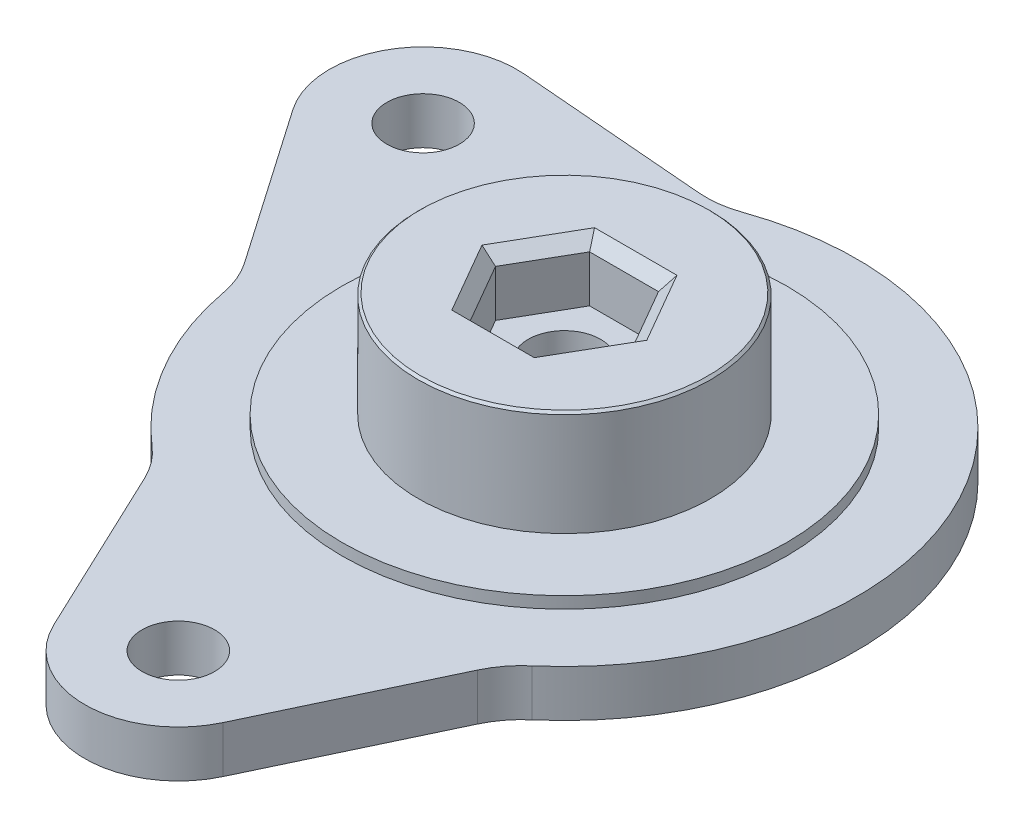
ISO-10303-21;
HEADER;
FILE_DESCRIPTION(('STEP AP214'),'2;1');
FILE_NAME('part.step','',(''),(''),'','','');
FILE_SCHEMA(('AUTOMOTIVE_DESIGN { 1 0 10303 214 1 1 1 1 }'));
ENDSEC;
DATA;
#1=APPLICATION_CONTEXT('core data for automotive mechanical design processes');
#2=APPLICATION_PROTOCOL_DEFINITION('international standard','automotive_design',2000,#1);
#3=PRODUCT_CONTEXT('',#1,'mechanical');
#4=PRODUCT('Part','Part','',(#3));
#5=PRODUCT_RELATED_PRODUCT_CATEGORY('part','',(#4));
#6=PRODUCT_DEFINITION_FORMATION('','',#4);
#7=PRODUCT_DEFINITION_CONTEXT('part definition',#1,'design');
#8=PRODUCT_DEFINITION('design','',#6,#7);
#9=PRODUCT_DEFINITION_SHAPE('','',#8);
#10=(LENGTH_UNIT() NAMED_UNIT(*) SI_UNIT(.MILLI.,.METRE.));
#11=(NAMED_UNIT(*) PLANE_ANGLE_UNIT() SI_UNIT($,.RADIAN.));
#12=(NAMED_UNIT(*) SI_UNIT($,.STERADIAN.) SOLID_ANGLE_UNIT());
#13=UNCERTAINTY_MEASURE_WITH_UNIT(LENGTH_MEASURE(1.E-05),#10,'distance_accuracy_value','');
#14=(GEOMETRIC_REPRESENTATION_CONTEXT(3) GLOBAL_UNCERTAINTY_ASSIGNED_CONTEXT((#13)) GLOBAL_UNIT_ASSIGNED_CONTEXT((#10,
#11,#12)) REPRESENTATION_CONTEXT('',''));
#15=CARTESIAN_POINT('',(0.,0.,0.));
#16=DIRECTION('',(0.,0.,1.));
#17=DIRECTION('',(1.,0.,0.));
#18=AXIS2_PLACEMENT_3D('',#15,#16,#17);
#19=CARTESIAN_POINT('',(0.,0.,0.));
#20=DIRECTION('',(0.,-1.,0.));
#21=DIRECTION('',(0.,0.,-1.));
#22=AXIS2_PLACEMENT_3D('',#19,#20,#21);
#23=CYLINDRICAL_SURFACE('',#22,25.);
#24=CARTESIAN_POINT('',(0.,0.,0.));
#25=DIRECTION('',(0.,-1.,0.));
#26=DIRECTION('',(0.,0.,-1.));
#27=AXIS2_PLACEMENT_3D('',#24,#25,#26);
#28=CIRCLE('',#27,25.);
#29=CARTESIAN_POINT('',(-16.2472606024002,0.,19.0006979586986));
#30=VERTEX_POINT('',#29);
#31=CARTESIAN_POINT('',(-24.5787174230683,0.,4.57019144423525));
#32=VERTEX_POINT('',#31);
#33=EDGE_CURVE('E342',#30,#32,#28,.T.);
#34=ORIENTED_EDGE('',*,*,#33,.F.);
#35=DIRECTION('',(0.,-1.,0.));
#36=VECTOR('',#35,1.);
#37=CARTESIAN_POINT('',(-16.2472606024002,0.,19.0006979586986));
#38=LINE('',#37,#36);
#39=CARTESIAN_POINT('',(-16.2472606024002,4.,19.0006979586986));
#40=VERTEX_POINT('',#39);
#41=EDGE_CURVE('E377',#30,#40,#38,.F.);
#42=ORIENTED_EDGE('',*,*,#41,.T.);
#43=CARTESIAN_POINT('',(0.,4.,0.));
#44=DIRECTION('',(0.,-1.,0.));
#45=DIRECTION('',(0.,0.,-1.));
#46=AXIS2_PLACEMENT_3D('',#43,#44,#45);
#47=CIRCLE('',#46,25.);
#48=CARTESIAN_POINT('',(-24.5787174230683,4.,4.57019144423525));
#49=VERTEX_POINT('',#48);
#50=EDGE_CURVE('E337',#40,#49,#47,.T.);
#51=ORIENTED_EDGE('',*,*,#50,.T.);
#52=DIRECTION('',(0.,-1.,0.));
#53=VECTOR('',#52,1.);
#54=CARTESIAN_POINT('',(-24.5787174230683,0.,4.57019144423525));
#55=LINE('',#54,#53);
#56=EDGE_CURVE('E373',#49,#32,#55,.T.);
#57=ORIENTED_EDGE('',*,*,#56,.T.);
#58=EDGE_LOOP('',(#34,#42,#51,#57));
#59=FACE_BOUND('',#58,.T.);
#60=ADVANCED_FACE('F43',(#59),#23,.T.);
#61=CARTESIAN_POINT('',(-8.33145682066789,0.,-23.570889402934));
#62=VERTEX_POINT('',#61);
#63=CARTESIAN_POINT('',(16.2472606024002,0.,19.0006979586986));
#64=VERTEX_POINT('',#63);
#65=EDGE_CURVE('E341',#62,#64,#28,.T.);
#66=ORIENTED_EDGE('',*,*,#65,.F.);
#67=DIRECTION('',(0.,-1.,0.));
#68=VECTOR('',#67,1.);
#69=CARTESIAN_POINT('',(-8.33145682066789,0.,-23.570889402934));
#70=LINE('',#69,#68);
#71=CARTESIAN_POINT('',(-8.33145682066789,4.,-23.570889402934));
#72=VERTEX_POINT('',#71);
#73=EDGE_CURVE('E363',#62,#72,#70,.F.);
#74=ORIENTED_EDGE('',*,*,#73,.T.);
#75=CARTESIAN_POINT('',(16.2472606024002,4.,19.0006979586986));
#76=VERTEX_POINT('',#75);
#77=EDGE_CURVE('E336',#72,#76,#47,.T.);
#78=ORIENTED_EDGE('',*,*,#77,.T.);
#79=DIRECTION('',(0.,-1.,0.));
#80=VECTOR('',#79,1.);
#81=CARTESIAN_POINT('',(16.2472606024002,0.,19.0006979586986));
#82=LINE('',#81,#80);
#83=EDGE_CURVE('E359',#76,#64,#82,.T.);
#84=ORIENTED_EDGE('',*,*,#83,.T.);
#85=EDGE_LOOP('',(#66,#74,#78,#84));
#86=FACE_BOUND('',#85,.T.);
#87=ADVANCED_FACE('F513',(#86),#23,.T.);
#88=CARTESIAN_POINT('',(0.,0.,0.));
#89=DIRECTION('',(0.,-1.,0.));
#90=DIRECTION('',(0.,0.,-1.));
#91=AXIS2_PLACEMENT_3D('',#88,#89,#90);
#92=PLANE('',#91);
#93=CARTESIAN_POINT('',(0.,0.,0.));
#94=DIRECTION('',(0.,1.,0.));
#95=DIRECTION('',(0.,0.,1.));
#96=AXIS2_PLACEMENT_3D('',#93,#94,#95);
#97=CIRCLE('',#96,3.1);
#98=CARTESIAN_POINT('',(0.,0.,-3.1));
#99=VERTEX_POINT('',#98);
#100=EDGE_CURVE('E271',#99,#99,#97,.T.);
#101=ORIENTED_EDGE('',*,*,#100,.T.);
#102=EDGE_LOOP('',(#101));
#103=FACE_BOUND('',#102,.T.);
#104=DIRECTION('',(-0.427635867687244,0.,-0.903951085328945));
#105=VECTOR('',#104,1.);
#106=CARTESIAN_POINT('',(-19.9881516044401,0.,9.45587730747449));
#107=LINE('',#106,#105);
#108=CARTESIAN_POINT('',(-7.23160868263156,0.,36.421086941498));
#109=VERTEX_POINT('',#108);
#110=CARTESIAN_POINT('',(-14.2147753125368,0.,21.6598343639842));
#111=VERTEX_POINT('',#110);
#112=EDGE_CURVE('E250',#109,#111,#107,.T.);
#113=ORIENTED_EDGE('',*,*,#112,.T.);
#114=CARTESIAN_POINT('',(-21.4463839951683,0.,25.0809213054821));
#115=DIRECTION('',(0.,-1.,0.));
#116=DIRECTION('',(0.,0.,-1.));
#117=AXIS2_PLACEMENT_3D('',#114,#115,#116);
#118=CIRCLE('',#117,8.);
#119=EDGE_CURVE('E395',#111,#30,#118,.F.);
#120=ORIENTED_EDGE('',*,*,#119,.T.);
#121=ORIENTED_EDGE('',*,*,#33,.T.);
#122=CARTESIAN_POINT('',(-32.4439069984501,0.,6.03265270639053));
#123=DIRECTION('',(0.,-1.,0.));
#124=DIRECTION('',(0.,0.,-1.));
#125=AXIS2_PLACEMENT_3D('',#122,#123,#124);
#126=CIRCLE('',#125,8.);
#127=CARTESIAN_POINT('',(-25.8653544572419,0.,1.48043934775248));
#128=VERTEX_POINT('',#127);
#129=EDGE_CURVE('E401',#32,#128,#126,.F.);
#130=ORIENTED_EDGE('',*,*,#129,.T.);
#131=DIRECTION('',(0.569026669829756,0.,0.82231906765103));
#132=VECTOR('',#131,1.);
#133=CARTESIAN_POINT('',(-18.1831057655618,0.,12.5823084104025));
#134=LINE('',#133,#132);
#135=CARTESIAN_POINT('',(-35.1573908660946,0.,-11.9477866413621));
#136=VERTEX_POINT('',#135);
#137=EDGE_CURVE('E211',#136,#128,#134,.T.);
#138=ORIENTED_EDGE('',*,*,#137,.F.);
#139=CARTESIAN_POINT('',(-28.5788383248864,0.,-16.5000000000001));
#140=DIRECTION('',(0.,1.,0.));
#141=DIRECTION('',(-0.866025403784436,0.,-0.500000000000004));
#142=AXIS2_PLACEMENT_3D('',#139,#140,#141);
#143=CIRCLE('',#142,8.);
#144=CARTESIAN_POINT('',(-27.925782183463,0.,-24.4733003001362));
#145=VERTEX_POINT('',#144);
#146=EDGE_CURVE('E192',#145,#136,#143,.T.);
#147=ORIENTED_EDGE('',*,*,#146,.F.);
#148=DIRECTION('',(0.996662537517003,0.,0.0816320176779226));
#149=VECTOR('',#148,1.);
#150=CARTESIAN_POINT('',(1.80504583887842,0.,-22.038185717877));
#151=LINE('',#150,#149);
#152=CARTESIAN_POINT('',(-11.650579144705,0.,-23.1402737117369));
#153=VERTEX_POINT('',#152);
#154=EDGE_CURVE('E209',#145,#153,#151,.T.);
#155=ORIENTED_EDGE('',*,*,#154,.T.);
#156=CARTESIAN_POINT('',(-10.9975230032816,0.,-31.1135740118729));
#157=DIRECTION('',(0.,-1.,0.));
#158=DIRECTION('',(0.,0.,-1.));
#159=AXIS2_PLACEMENT_3D('',#156,#157,#158);
#160=CIRCLE('',#159,8.);
#161=EDGE_CURVE('E383',#153,#62,#160,.F.);
#162=ORIENTED_EDGE('',*,*,#161,.T.);
#163=ORIENTED_EDGE('',*,*,#65,.T.);
#164=CARTESIAN_POINT('',(21.4463839951683,0.,25.0809213054821));
#165=DIRECTION('',(0.,-1.,0.));
#166=DIRECTION('',(0.,0.,-1.));
#167=AXIS2_PLACEMENT_3D('',#164,#165,#166);
#168=CIRCLE('',#167,8.);
#169=CARTESIAN_POINT('',(14.2147753125367,0.,21.6598343639842));
#170=VERTEX_POINT('',#169);
#171=EDGE_CURVE('E389',#64,#170,#168,.F.);
#172=ORIENTED_EDGE('',*,*,#171,.T.);
#173=DIRECTION('',(0.427635867687244,0.,-0.903951085328945));
#174=VECTOR('',#173,1.);
#175=CARTESIAN_POINT('',(19.9881516044401,0.,9.45587730747448));
#176=LINE('',#175,#174);
#177=CARTESIAN_POINT('',(7.23160868263156,0.,36.421086941498));
#178=VERTEX_POINT('',#177);
#179=EDGE_CURVE('E257',#178,#170,#176,.T.);
#180=ORIENTED_EDGE('',*,*,#179,.F.);
#181=CARTESIAN_POINT('',(0.,0.,33.));
#182=DIRECTION('',(0.,1.,0.));
#183=DIRECTION('',(0.,0.,1.));
#184=AXIS2_PLACEMENT_3D('',#181,#182,#183);
#185=CIRCLE('',#184,8.);
#186=EDGE_CURVE('E253',#109,#178,#185,.T.);
#187=ORIENTED_EDGE('',*,*,#186,.F.);
#188=EDGE_LOOP('',(#113,#120,#121,#130,#138,#147,#155,#162,#163,#172,#180,#187));
#189=FACE_BOUND('',#188,.T.);
#190=CARTESIAN_POINT('',(0.,0.,33.));
#191=DIRECTION('',(0.,1.,0.));
#192=DIRECTION('',(0.,0.,1.));
#193=AXIS2_PLACEMENT_3D('',#190,#191,#192);
#194=CIRCLE('',#193,3.1);
#195=CARTESIAN_POINT('',(0.,0.,36.1));
#196=VERTEX_POINT('',#195);
#197=EDGE_CURVE('E261',#196,#196,#194,.T.);
#198=ORIENTED_EDGE('',*,*,#197,.T.);
#199=EDGE_LOOP('',(#198));
#200=FACE_BOUND('',#199,.T.);
#201=CARTESIAN_POINT('',(-28.5788383248864,0.,-16.5000000000001));
#202=DIRECTION('',(0.,1.,0.));
#203=DIRECTION('',(-0.866025403784436,0.,-0.500000000000004));
#204=AXIS2_PLACEMENT_3D('',#201,#202,#203);
#205=CIRCLE('',#204,3.1);
#206=CARTESIAN_POINT('',(-31.2635170766182,0.,-18.0500000000001));
#207=VERTEX_POINT('',#206);
#208=EDGE_CURVE('E227',#207,#207,#205,.T.);
#209=ORIENTED_EDGE('',*,*,#208,.T.);
#210=EDGE_LOOP('',(#209));
#211=FACE_BOUND('',#210,.T.);
#212=ADVANCED_FACE('F207',(#103,#189,#200,#211),#92,.T.);
#213=CARTESIAN_POINT('',(25.,4.,0.));
#214=DIRECTION('',(0.,1.,0.));
#215=DIRECTION('',(0.,0.,1.));
#216=AXIS2_PLACEMENT_3D('',#213,#214,#215);
#217=PLANE('',#216);
#218=CARTESIAN_POINT('',(0.,4.,0.));
#219=DIRECTION('',(0.,-1.,0.));
#220=DIRECTION('',(0.,0.,-1.));
#221=AXIS2_PLACEMENT_3D('',#218,#219,#220);
#222=CIRCLE('',#221,19.);
#223=CARTESIAN_POINT('',(0.,4.,-19.));
#224=VERTEX_POINT('',#223);
#225=EDGE_CURVE('E332',#224,#224,#222,.T.);
#226=ORIENTED_EDGE('',*,*,#225,.T.);
#227=EDGE_LOOP('',(#226));
#228=FACE_BOUND('',#227,.T.);
#229=ORIENTED_EDGE('',*,*,#50,.F.);
#230=CARTESIAN_POINT('',(-21.4463839951683,4.,25.0809213054821));
#231=DIRECTION('',(0.,1.,0.));
#232=DIRECTION('',(0.,0.,1.));
#233=AXIS2_PLACEMENT_3D('',#230,#231,#232);
#234=CIRCLE('',#233,8.);
#235=CARTESIAN_POINT('',(-14.2147753125368,4.,21.6598343639842));
#236=VERTEX_POINT('',#235);
#237=EDGE_CURVE('E398',#40,#236,#234,.F.);
#238=ORIENTED_EDGE('',*,*,#237,.T.);
#239=DIRECTION('',(-0.427635867687244,0.,-0.903951085328945));
#240=VECTOR('',#239,1.);
#241=CARTESIAN_POINT('',(-19.9881516044401,4.,9.45587730747449));
#242=LINE('',#241,#240);
#243=CARTESIAN_POINT('',(-7.23160868263156,4.,36.421086941498));
#244=VERTEX_POINT('',#243);
#245=EDGE_CURVE('E246',#244,#236,#242,.T.);
#246=ORIENTED_EDGE('',*,*,#245,.F.);
#247=CARTESIAN_POINT('',(0.,4.,33.));
#248=DIRECTION('',(0.,1.,0.));
#249=DIRECTION('',(0.,0.,1.));
#250=AXIS2_PLACEMENT_3D('',#247,#248,#249);
#251=CIRCLE('',#250,8.);
#252=CARTESIAN_POINT('',(7.23160868263156,4.,36.421086941498));
#253=VERTEX_POINT('',#252);
#254=EDGE_CURVE('E242',#244,#253,#251,.T.);
#255=ORIENTED_EDGE('',*,*,#254,.T.);
#256=DIRECTION('',(0.427635867687244,0.,-0.903951085328945));
#257=VECTOR('',#256,1.);
#258=CARTESIAN_POINT('',(19.9881516044401,4.,9.45587730747448));
#259=LINE('',#258,#257);
#260=CARTESIAN_POINT('',(14.2147753125367,4.,21.6598343639842));
#261=VERTEX_POINT('',#260);
#262=EDGE_CURVE('E238',#253,#261,#259,.T.);
#263=ORIENTED_EDGE('',*,*,#262,.T.);
#264=CARTESIAN_POINT('',(21.4463839951683,4.,25.0809213054821));
#265=DIRECTION('',(0.,1.,0.));
#266=DIRECTION('',(0.,0.,1.));
#267=AXIS2_PLACEMENT_3D('',#264,#265,#266);
#268=CIRCLE('',#267,8.);
#269=EDGE_CURVE('E392',#261,#76,#268,.F.);
#270=ORIENTED_EDGE('',*,*,#269,.T.);
#271=ORIENTED_EDGE('',*,*,#77,.F.);
#272=CARTESIAN_POINT('',(-10.9975230032816,4.,-31.1135740118729));
#273=DIRECTION('',(0.,1.,0.));
#274=DIRECTION('',(0.,0.,1.));
#275=AXIS2_PLACEMENT_3D('',#272,#273,#274);
#276=CIRCLE('',#275,8.);
#277=CARTESIAN_POINT('',(-11.650579144705,4.,-23.1402737117369));
#278=VERTEX_POINT('',#277);
#279=EDGE_CURVE('E386',#72,#278,#276,.F.);
#280=ORIENTED_EDGE('',*,*,#279,.T.);
#281=DIRECTION('',(0.996662537517003,0.,0.0816320176779225));
#282=VECTOR('',#281,1.);
#283=CARTESIAN_POINT('',(1.80504583887842,4.,-22.038185717877));
#284=LINE('',#283,#282);
#285=CARTESIAN_POINT('',(-27.925782183463,4.,-24.4733003001362));
#286=VERTEX_POINT('',#285);
#287=EDGE_CURVE('E219',#286,#278,#284,.T.);
#288=ORIENTED_EDGE('',*,*,#287,.F.);
#289=CARTESIAN_POINT('',(-28.5788383248864,4.,-16.5000000000001));
#290=DIRECTION('',(0.,1.,0.));
#291=DIRECTION('',(0.,0.,1.));
#292=AXIS2_PLACEMENT_3D('',#289,#290,#291);
#293=CIRCLE('',#292,8.);
#294=CARTESIAN_POINT('',(-35.1573908660946,4.,-11.9477866413621));
#295=VERTEX_POINT('',#294);
#296=EDGE_CURVE('E195',#286,#295,#293,.T.);
#297=ORIENTED_EDGE('',*,*,#296,.T.);
#298=DIRECTION('',(0.569026669829755,0.,0.82231906765103));
#299=VECTOR('',#298,1.);
#300=CARTESIAN_POINT('',(-18.1831057655618,4.,12.5823084104025));
#301=LINE('',#300,#299);
#302=CARTESIAN_POINT('',(-25.8653544572419,4.,1.48043934775249));
#303=VERTEX_POINT('',#302);
#304=EDGE_CURVE('E237',#295,#303,#301,.T.);
#305=ORIENTED_EDGE('',*,*,#304,.T.);
#306=CARTESIAN_POINT('',(-32.4439069984501,4.,6.03265270639053));
#307=DIRECTION('',(0.,1.,0.));
#308=DIRECTION('',(0.,0.,1.));
#309=AXIS2_PLACEMENT_3D('',#306,#307,#308);
#310=CIRCLE('',#309,8.);
#311=EDGE_CURVE('E404',#303,#49,#310,.F.);
#312=ORIENTED_EDGE('',*,*,#311,.T.);
#313=EDGE_LOOP('',(#229,#238,#246,#255,#263,#270,#271,#280,#288,#297,#305,#312));
#314=FACE_BOUND('',#313,.T.);
#315=CARTESIAN_POINT('',(0.,4.,33.));
#316=DIRECTION('',(0.,1.,0.));
#317=DIRECTION('',(0.,0.,1.));
#318=AXIS2_PLACEMENT_3D('',#315,#316,#317);
#319=CIRCLE('',#318,3.1);
#320=CARTESIAN_POINT('',(0.,4.,36.1));
#321=VERTEX_POINT('',#320);
#322=EDGE_CURVE('E201',#321,#321,#319,.T.);
#323=ORIENTED_EDGE('',*,*,#322,.F.);
#324=EDGE_LOOP('',(#323));
#325=FACE_BOUND('',#324,.T.);
#326=CARTESIAN_POINT('',(-28.5788383248864,4.,-16.5000000000001));
#327=DIRECTION('',(0.,1.,0.));
#328=DIRECTION('',(0.,0.,1.));
#329=AXIS2_PLACEMENT_3D('',#326,#327,#328);
#330=CIRCLE('',#329,3.1);
#331=CARTESIAN_POINT('',(-28.5788383248864,4.,-13.4000000000001));
#332=VERTEX_POINT('',#331);
#333=EDGE_CURVE('E233',#332,#332,#330,.T.);
#334=ORIENTED_EDGE('',*,*,#333,.F.);
#335=EDGE_LOOP('',(#334));
#336=FACE_BOUND('',#335,.T.);
#337=ADVANCED_FACE('F523',(#228,#314,#325,#336),#217,.T.);
#338=CARTESIAN_POINT('',(0.,0.,0.));
#339=DIRECTION('',(0.,-1.,0.));
#340=DIRECTION('',(0.,0.,-1.));
#341=AXIS2_PLACEMENT_3D('',#338,#339,#340);
#342=CYLINDRICAL_SURFACE('',#341,19.);
#343=CARTESIAN_POINT('',(0.,5.,0.));
#344=DIRECTION('',(0.,-1.,0.));
#345=DIRECTION('',(0.,0.,-1.));
#346=AXIS2_PLACEMENT_3D('',#343,#344,#345);
#347=CIRCLE('',#346,19.);
#348=CARTESIAN_POINT('',(0.,5.,-19.));
#349=VERTEX_POINT('',#348);
#350=EDGE_CURVE('E328',#349,#349,#347,.T.);
#351=ORIENTED_EDGE('',*,*,#350,.T.);
#352=EDGE_LOOP('',(#351));
#353=FACE_BOUND('',#352,.T.);
#354=ORIENTED_EDGE('',*,*,#225,.F.);
#355=EDGE_LOOP('',(#354));
#356=FACE_BOUND('',#355,.T.);
#357=ADVANCED_FACE('F631',(#353,#356),#342,.T.);
#358=CARTESIAN_POINT('',(19.,5.,0.));
#359=DIRECTION('',(0.,1.,0.));
#360=DIRECTION('',(0.,0.,1.));
#361=AXIS2_PLACEMENT_3D('',#358,#359,#360);
#362=PLANE('',#361);
#363=CARTESIAN_POINT('',(0.,5.,0.));
#364=DIRECTION('',(0.,-1.,0.));
#365=DIRECTION('',(0.,0.,-1.));
#366=AXIS2_PLACEMENT_3D('',#363,#364,#365);
#367=CIRCLE('',#366,12.5);
#368=CARTESIAN_POINT('',(0.,5.,-12.5));
#369=VERTEX_POINT('',#368);
#370=EDGE_CURVE('E308',#369,#369,#367,.T.);
#371=ORIENTED_EDGE('',*,*,#370,.T.);
#372=EDGE_LOOP('',(#371));
#373=FACE_BOUND('',#372,.T.);
#374=ORIENTED_EDGE('',*,*,#350,.F.);
#375=EDGE_LOOP('',(#374));
#376=FACE_BOUND('',#375,.T.);
#377=ADVANCED_FACE('F628',(#373,#376),#362,.T.);
#378=CARTESIAN_POINT('',(0.,0.,0.));
#379=DIRECTION('',(0.,-1.,0.));
#380=DIRECTION('',(0.,0.,-1.));
#381=AXIS2_PLACEMENT_3D('',#378,#379,#380);
#382=CYLINDRICAL_SURFACE('',#381,12.5);
#383=CARTESIAN_POINT('',(0.,13.8,0.));
#384=DIRECTION('',(0.,1.,0.));
#385=DIRECTION('',(0.,0.,1.));
#386=AXIS2_PLACEMENT_3D('',#383,#384,#385);
#387=CIRCLE('',#386,12.5);
#388=CARTESIAN_POINT('',(0.,13.8,12.5));
#389=VERTEX_POINT('',#388);
#390=EDGE_CURVE('E346',#389,#389,#387,.F.);
#391=ORIENTED_EDGE('',*,*,#390,.T.);
#392=EDGE_LOOP('',(#391));
#393=FACE_BOUND('',#392,.T.);
#394=ORIENTED_EDGE('',*,*,#370,.F.);
#395=EDGE_LOOP('',(#394));
#396=FACE_BOUND('',#395,.T.);
#397=ADVANCED_FACE('F625',(#393,#396),#382,.T.);
#398=CARTESIAN_POINT('',(12.5,14.,0.));
#399=DIRECTION('',(0.,1.,0.));
#400=DIRECTION('',(0.,0.,1.));
#401=AXIS2_PLACEMENT_3D('',#398,#399,#400);
#402=PLANE('',#401);
#403=DIRECTION('',(-1.,0.,0.));
#404=VECTOR('',#403,1.);
#405=CARTESIAN_POINT('',(-2.94448637286709,14.,6.1));
#406=LINE('',#405,#404);
#407=CARTESIAN_POINT('',(3.52183664205672,14.,6.1));
#408=VERTEX_POINT('',#407);
#409=CARTESIAN_POINT('',(-3.52183664205672,14.,6.1));
#410=VERTEX_POINT('',#409);
#411=EDGE_CURVE('E423',#408,#410,#406,.T.);
#412=ORIENTED_EDGE('',*,*,#411,.T.);
#413=DIRECTION('',(-0.5,0.,-0.866025403784439));
#414=VECTOR('',#413,1.);
#415=CARTESIAN_POINT('',(-6.75499814951862,14.,0.500000000000001));
#416=LINE('',#415,#414);
#417=CARTESIAN_POINT('',(-7.04367328411343,14.,0.));
#418=VERTEX_POINT('',#417);
#419=EDGE_CURVE('E426',#410,#418,#416,.T.);
#420=ORIENTED_EDGE('',*,*,#419,.T.);
#421=DIRECTION('',(0.5,0.,-0.866025403784439));
#422=VECTOR('',#421,1.);
#423=CARTESIAN_POINT('',(-3.81051177665153,14.,-5.6));
#424=LINE('',#423,#422);
#425=CARTESIAN_POINT('',(-3.52183664205672,14.,-6.1));
#426=VERTEX_POINT('',#425);
#427=EDGE_CURVE('E414',#418,#426,#424,.T.);
#428=ORIENTED_EDGE('',*,*,#427,.T.);
#429=DIRECTION('',(1.,0.,0.));
#430=VECTOR('',#429,1.);
#431=CARTESIAN_POINT('',(2.94448637286709,14.,-6.1));
#432=LINE('',#431,#430);
#433=CARTESIAN_POINT('',(3.52183664205672,14.,-6.1));
#434=VERTEX_POINT('',#433);
#435=EDGE_CURVE('E411',#426,#434,#432,.T.);
#436=ORIENTED_EDGE('',*,*,#435,.T.);
#437=DIRECTION('',(0.5,0.,0.866025403784439));
#438=VECTOR('',#437,1.);
#439=CARTESIAN_POINT('',(6.75499814951862,14.,-0.500000000000002));
#440=LINE('',#439,#438);
#441=CARTESIAN_POINT('',(7.04367328411343,14.,0.));
#442=VERTEX_POINT('',#441);
#443=EDGE_CURVE('E417',#434,#442,#440,.T.);
#444=ORIENTED_EDGE('',*,*,#443,.T.);
#445=DIRECTION('',(-0.5,0.,0.866025403784439));
#446=VECTOR('',#445,1.);
#447=CARTESIAN_POINT('',(3.81051177665153,14.,5.6));
#448=LINE('',#447,#446);
#449=EDGE_CURVE('E420',#442,#408,#448,.T.);
#450=ORIENTED_EDGE('',*,*,#449,.T.);
#451=EDGE_LOOP('',(#412,#420,#428,#436,#444,#450));
#452=FACE_BOUND('',#451,.T.);
#453=CARTESIAN_POINT('',(0.,14.,0.));
#454=DIRECTION('',(0.,1.,0.));
#455=DIRECTION('',(0.,0.,1.));
#456=AXIS2_PLACEMENT_3D('',#453,#454,#455);
#457=CIRCLE('',#456,12.3);
#458=CARTESIAN_POINT('',(0.,14.,12.3));
#459=VERTEX_POINT('',#458);
#460=EDGE_CURVE('E353',#459,#459,#457,.T.);
#461=ORIENTED_EDGE('',*,*,#460,.T.);
#462=EDGE_LOOP('',(#461));
#463=FACE_BOUND('',#462,.T.);
#464=ADVANCED_FACE('F470',(#452,#463),#402,.T.);
#465=CARTESIAN_POINT('',(2.94448637286709,9.,5.1));
#466=DIRECTION('',(0.866025403784439,0.,0.5));
#467=DIRECTION('',(0.5,0.,-0.866025403784439));
#468=AXIS2_PLACEMENT_3D('',#465,#466,#467);
#469=PLANE('',#468);
#470=DIRECTION('',(0.,1.,0.));
#471=VECTOR('',#470,1.);
#472=CARTESIAN_POINT('',(2.94448637286709,9.,5.1));
#473=LINE('',#472,#471);
#474=CARTESIAN_POINT('',(2.94448637286709,9.,5.1));
#475=VERTEX_POINT('',#474);
#476=CARTESIAN_POINT('',(2.94448637286709,13.,5.1));
#477=VERTEX_POINT('',#476);
#478=EDGE_CURVE('E304',#475,#477,#473,.T.);
#479=ORIENTED_EDGE('',*,*,#478,.T.);
#480=DIRECTION('',(0.5,0.,-0.866025403784439));
#481=VECTOR('',#480,1.);
#482=CARTESIAN_POINT('',(5.88897274573418,13.,0.));
#483=LINE('',#482,#481);
#484=CARTESIAN_POINT('',(5.88897274573418,13.,0.));
#485=VERTEX_POINT('',#484);
#486=EDGE_CURVE('E433',#477,#485,#483,.T.);
#487=ORIENTED_EDGE('',*,*,#486,.T.);
#488=DIRECTION('',(0.,1.,0.));
#489=VECTOR('',#488,1.);
#490=CARTESIAN_POINT('',(5.88897274573418,9.,0.));
#491=LINE('',#490,#489);
#492=CARTESIAN_POINT('',(5.88897274573418,9.,0.));
#493=VERTEX_POINT('',#492);
#494=EDGE_CURVE('E303',#493,#485,#491,.T.);
#495=ORIENTED_EDGE('',*,*,#494,.F.);
#496=DIRECTION('',(0.5,0.,-0.866025403784439));
#497=VECTOR('',#496,1.);
#498=CARTESIAN_POINT('',(2.94448637286709,9.,5.1));
#499=LINE('',#498,#497);
#500=EDGE_CURVE('E279',#475,#493,#499,.T.);
#501=ORIENTED_EDGE('',*,*,#500,.F.);
#502=EDGE_LOOP('',(#479,#487,#495,#501));
#503=FACE_BOUND('',#502,.T.);
#504=ADVANCED_FACE('F495',(#503),#469,.F.);
#505=CARTESIAN_POINT('',(-2.94448637286709,9.,5.1));
#506=DIRECTION('',(0.,0.,1.));
#507=DIRECTION('',(1.,0.,0.));
#508=AXIS2_PLACEMENT_3D('',#505,#506,#507);
#509=PLANE('',#508);
#510=DIRECTION('',(0.,1.,0.));
#511=VECTOR('',#510,1.);
#512=CARTESIAN_POINT('',(-2.94448637286709,9.,5.1));
#513=LINE('',#512,#511);
#514=CARTESIAN_POINT('',(-2.94448637286709,9.,5.1));
#515=VERTEX_POINT('',#514);
#516=CARTESIAN_POINT('',(-2.94448637286709,13.,5.1));
#517=VERTEX_POINT('',#516);
#518=EDGE_CURVE('E309',#515,#517,#513,.T.);
#519=ORIENTED_EDGE('',*,*,#518,.T.);
#520=DIRECTION('',(1.,0.,0.));
#521=VECTOR('',#520,1.);
#522=CARTESIAN_POINT('',(2.94448637286709,13.,5.1));
#523=LINE('',#522,#521);
#524=EDGE_CURVE('E430',#517,#477,#523,.T.);
#525=ORIENTED_EDGE('',*,*,#524,.T.);
#526=ORIENTED_EDGE('',*,*,#478,.F.);
#527=DIRECTION('',(1.,0.,0.));
#528=VECTOR('',#527,1.);
#529=CARTESIAN_POINT('',(-2.94448637286709,9.,5.1));
#530=LINE('',#529,#528);
#531=EDGE_CURVE('E299',#515,#475,#530,.T.);
#532=ORIENTED_EDGE('',*,*,#531,.F.);
#533=EDGE_LOOP('',(#519,#525,#526,#532));
#534=FACE_BOUND('',#533,.T.);
#535=ADVANCED_FACE('F609',(#534),#509,.F.);
#536=CARTESIAN_POINT('',(-5.88897274573418,9.,0.));
#537=DIRECTION('',(-0.866025403784439,0.,0.5));
#538=DIRECTION('',(0.5,0.,0.866025403784439));
#539=AXIS2_PLACEMENT_3D('',#536,#537,#538);
#540=PLANE('',#539);
#541=DIRECTION('',(0.,1.,0.));
#542=VECTOR('',#541,1.);
#543=CARTESIAN_POINT('',(-5.88897274573418,9.,0.));
#544=LINE('',#543,#542);
#545=CARTESIAN_POINT('',(-5.88897274573418,9.,0.));
#546=VERTEX_POINT('',#545);
#547=CARTESIAN_POINT('',(-5.88897274573418,13.,0.));
#548=VERTEX_POINT('',#547);
#549=EDGE_CURVE('E313',#546,#548,#544,.T.);
#550=ORIENTED_EDGE('',*,*,#549,.T.);
#551=DIRECTION('',(0.5,0.,0.866025403784439));
#552=VECTOR('',#551,1.);
#553=CARTESIAN_POINT('',(-2.94448637286709,13.,5.1));
#554=LINE('',#553,#552);
#555=EDGE_CURVE('E407',#548,#517,#554,.T.);
#556=ORIENTED_EDGE('',*,*,#555,.T.);
#557=ORIENTED_EDGE('',*,*,#518,.F.);
#558=DIRECTION('',(0.5,0.,0.866025403784438));
#559=VECTOR('',#558,1.);
#560=CARTESIAN_POINT('',(-5.88897274573418,9.,0.));
#561=LINE('',#560,#559);
#562=EDGE_CURVE('E295',#546,#515,#561,.T.);
#563=ORIENTED_EDGE('',*,*,#562,.F.);
#564=EDGE_LOOP('',(#550,#556,#557,#563));
#565=FACE_BOUND('',#564,.T.);
#566=ADVANCED_FACE('F485',(#565),#540,.F.);
#567=CARTESIAN_POINT('',(-2.94448637286709,9.,-5.1));
#568=DIRECTION('',(-0.866025403784439,0.,-0.5));
#569=DIRECTION('',(-0.5,0.,0.866025403784439));
#570=AXIS2_PLACEMENT_3D('',#567,#568,#569);
#571=PLANE('',#570);
#572=DIRECTION('',(0.,1.,0.));
#573=VECTOR('',#572,1.);
#574=CARTESIAN_POINT('',(-2.94448637286709,9.,-5.1));
#575=LINE('',#574,#573);
#576=CARTESIAN_POINT('',(-2.94448637286709,9.,-5.1));
#577=VERTEX_POINT('',#576);
#578=CARTESIAN_POINT('',(-2.94448637286709,13.,-5.1));
#579=VERTEX_POINT('',#578);
#580=EDGE_CURVE('E317',#577,#579,#575,.T.);
#581=ORIENTED_EDGE('',*,*,#580,.T.);
#582=DIRECTION('',(-0.5,0.,0.866025403784439));
#583=VECTOR('',#582,1.);
#584=CARTESIAN_POINT('',(-5.88897274573418,13.,0.));
#585=LINE('',#584,#583);
#586=EDGE_CURVE('E54',#579,#548,#585,.T.);
#587=ORIENTED_EDGE('',*,*,#586,.T.);
#588=ORIENTED_EDGE('',*,*,#549,.F.);
#589=DIRECTION('',(-0.5,0.,0.866025403784439));
#590=VECTOR('',#589,1.);
#591=CARTESIAN_POINT('',(-2.94448637286709,9.,-5.1));
#592=LINE('',#591,#590);
#593=EDGE_CURVE('E291',#577,#546,#592,.T.);
#594=ORIENTED_EDGE('',*,*,#593,.F.);
#595=EDGE_LOOP('',(#581,#587,#588,#594));
#596=FACE_BOUND('',#595,.T.);
#597=ADVANCED_FACE('F481',(#596),#571,.F.);
#598=CARTESIAN_POINT('',(2.94448637286709,9.,-5.1));
#599=DIRECTION('',(0.,0.,-1.));
#600=DIRECTION('',(-1.,0.,0.));
#601=AXIS2_PLACEMENT_3D('',#598,#599,#600);
#602=PLANE('',#601);
#603=DIRECTION('',(0.,1.,0.));
#604=VECTOR('',#603,1.);
#605=CARTESIAN_POINT('',(2.94448637286709,9.,-5.1));
#606=LINE('',#605,#604);
#607=CARTESIAN_POINT('',(2.94448637286709,9.,-5.1));
#608=VERTEX_POINT('',#607);
#609=CARTESIAN_POINT('',(2.94448637286709,13.,-5.1));
#610=VERTEX_POINT('',#609);
#611=EDGE_CURVE('E320',#608,#610,#606,.T.);
#612=ORIENTED_EDGE('',*,*,#611,.T.);
#613=DIRECTION('',(-1.,0.,0.));
#614=VECTOR('',#613,1.);
#615=CARTESIAN_POINT('',(-2.94448637286709,13.,-5.1));
#616=LINE('',#615,#614);
#617=EDGE_CURVE('E11',#610,#579,#616,.T.);
#618=ORIENTED_EDGE('',*,*,#617,.T.);
#619=ORIENTED_EDGE('',*,*,#580,.F.);
#620=DIRECTION('',(-1.,0.,0.));
#621=VECTOR('',#620,1.);
#622=CARTESIAN_POINT('',(2.94448637286709,9.,-5.1));
#623=LINE('',#622,#621);
#624=EDGE_CURVE('E287',#608,#577,#623,.T.);
#625=ORIENTED_EDGE('',*,*,#624,.F.);
#626=EDGE_LOOP('',(#612,#618,#619,#625));
#627=FACE_BOUND('',#626,.T.);
#628=ADVANCED_FACE('F491',(#627),#602,.F.);
#629=CARTESIAN_POINT('',(5.88897274573418,9.,0.));
#630=DIRECTION('',(0.866025403784439,0.,-0.5));
#631=DIRECTION('',(-0.5,0.,-0.866025403784439));
#632=AXIS2_PLACEMENT_3D('',#629,#630,#631);
#633=PLANE('',#632);
#634=ORIENTED_EDGE('',*,*,#494,.T.);
#635=DIRECTION('',(-0.5,0.,-0.866025403784439));
#636=VECTOR('',#635,1.);
#637=CARTESIAN_POINT('',(2.94448637286709,13.,-5.1));
#638=LINE('',#637,#636);
#639=EDGE_CURVE('E68',#485,#610,#638,.T.);
#640=ORIENTED_EDGE('',*,*,#639,.T.);
#641=ORIENTED_EDGE('',*,*,#611,.F.);
#642=DIRECTION('',(-0.5,0.,-0.866025403784438));
#643=VECTOR('',#642,1.);
#644=CARTESIAN_POINT('',(5.88897274573418,9.,0.));
#645=LINE('',#644,#643);
#646=EDGE_CURVE('E283',#493,#608,#645,.T.);
#647=ORIENTED_EDGE('',*,*,#646,.F.);
#648=EDGE_LOOP('',(#634,#640,#641,#647));
#649=FACE_BOUND('',#648,.T.);
#650=ADVANCED_FACE('F492',(#649),#633,.F.);
#651=CARTESIAN_POINT('',(0.,9.,0.));
#652=DIRECTION('',(0.,1.,0.));
#653=DIRECTION('',(0.,0.,1.));
#654=AXIS2_PLACEMENT_3D('',#651,#652,#653);
#655=PLANE('',#654);
#656=CARTESIAN_POINT('',(0.,9.,0.));
#657=DIRECTION('',(0.,1.,0.));
#658=DIRECTION('',(0.,0.,1.));
#659=AXIS2_PLACEMENT_3D('',#656,#657,#658);
#660=CIRCLE('',#659,3.1);
#661=CARTESIAN_POINT('',(0.,9.,-3.1));
#662=VERTEX_POINT('',#661);
#663=EDGE_CURVE('E278',#662,#662,#660,.F.);
#664=ORIENTED_EDGE('',*,*,#663,.T.);
#665=EDGE_LOOP('',(#664));
#666=FACE_BOUND('',#665,.T.);
#667=ORIENTED_EDGE('',*,*,#500,.T.);
#668=ORIENTED_EDGE('',*,*,#646,.T.);
#669=ORIENTED_EDGE('',*,*,#624,.T.);
#670=ORIENTED_EDGE('',*,*,#593,.T.);
#671=ORIENTED_EDGE('',*,*,#562,.T.);
#672=ORIENTED_EDGE('',*,*,#531,.T.);
#673=EDGE_LOOP('',(#667,#668,#669,#670,#671,#672));
#674=FACE_BOUND('',#673,.T.);
#675=ADVANCED_FACE('F488',(#666,#674),#655,.T.);
#676=CARTESIAN_POINT('',(0.,14.,0.));
#677=DIRECTION('',(0.,-1.,0.));
#678=DIRECTION('',(0.,0.,-1.));
#679=AXIS2_PLACEMENT_3D('',#676,#677,#678);
#680=CYLINDRICAL_SURFACE('',#679,3.1);
#681=CARTESIAN_POINT('',(0.,9.,-3.1));
#682=CARTESIAN_POINT('',(0.,8.90625,-3.1));
#683=CARTESIAN_POINT('',(0.,8.8125,-3.1));
#684=CARTESIAN_POINT('',(0.,8.625,-3.1));
#685=CARTESIAN_POINT('',(0.,8.53125,-3.1));
#686=CARTESIAN_POINT('',(0.,8.34375,-3.1));
#687=CARTESIAN_POINT('',(0.,8.25,-3.1));
#688=CARTESIAN_POINT('',(0.,8.0625,-3.1));
#689=CARTESIAN_POINT('',(0.,7.96875,-3.1));
#690=CARTESIAN_POINT('',(0.,7.78125,-3.1));
#691=CARTESIAN_POINT('',(0.,7.6875,-3.1));
#692=CARTESIAN_POINT('',(0.,7.5,-3.1));
#693=CARTESIAN_POINT('',(0.,7.40625,-3.1));
#694=CARTESIAN_POINT('',(0.,7.21875,-3.1));
#695=CARTESIAN_POINT('',(0.,7.125,-3.1));
#696=CARTESIAN_POINT('',(0.,6.9375,-3.1));
#697=CARTESIAN_POINT('',(0.,6.84375,-3.1));
#698=CARTESIAN_POINT('',(0.,6.65625,-3.1));
#699=CARTESIAN_POINT('',(0.,6.5625,-3.1));
#700=CARTESIAN_POINT('',(0.,6.375,-3.1));
#701=CARTESIAN_POINT('',(0.,6.28125,-3.1));
#702=CARTESIAN_POINT('',(0.,6.09375,-3.1));
#703=CARTESIAN_POINT('',(0.,6.,-3.1));
#704=CARTESIAN_POINT('',(0.,5.8125,-3.1));
#705=CARTESIAN_POINT('',(0.,5.71875,-3.1));
#706=CARTESIAN_POINT('',(0.,5.53125,-3.1));
#707=CARTESIAN_POINT('',(0.,5.4375,-3.1));
#708=CARTESIAN_POINT('',(0.,5.25,-3.1));
#709=CARTESIAN_POINT('',(0.,5.15625,-3.1));
#710=CARTESIAN_POINT('',(0.,4.96875,-3.1));
#711=CARTESIAN_POINT('',(0.,4.875,-3.1));
#712=CARTESIAN_POINT('',(0.,4.6875,-3.1));
#713=CARTESIAN_POINT('',(0.,4.59375,-3.1));
#714=CARTESIAN_POINT('',(0.,4.40625,-3.1));
#715=CARTESIAN_POINT('',(0.,4.3125,-3.1));
#716=CARTESIAN_POINT('',(0.,4.125,-3.1));
#717=CARTESIAN_POINT('',(0.,4.03125,-3.1));
#718=CARTESIAN_POINT('',(0.,3.84375,-3.1));
#719=CARTESIAN_POINT('',(0.,3.75,-3.1));
#720=CARTESIAN_POINT('',(0.,3.5625,-3.1));
#721=CARTESIAN_POINT('',(0.,3.46875,-3.1));
#722=CARTESIAN_POINT('',(0.,3.28125,-3.1));
#723=CARTESIAN_POINT('',(0.,3.1875,-3.1));
#724=CARTESIAN_POINT('',(0.,3.,-3.1));
#725=CARTESIAN_POINT('',(0.,2.90625,-3.1));
#726=CARTESIAN_POINT('',(0.,2.71875,-3.1));
#727=CARTESIAN_POINT('',(0.,2.625,-3.1));
#728=CARTESIAN_POINT('',(0.,2.4375,-3.1));
#729=CARTESIAN_POINT('',(0.,2.34375,-3.1));
#730=CARTESIAN_POINT('',(0.,2.15625,-3.1));
#731=CARTESIAN_POINT('',(0.,2.0625,-3.1));
#732=CARTESIAN_POINT('',(0.,1.875,-3.1));
#733=CARTESIAN_POINT('',(0.,1.78125,-3.1));
#734=CARTESIAN_POINT('',(0.,1.59375,-3.1));
#735=CARTESIAN_POINT('',(0.,1.5,-3.1));
#736=CARTESIAN_POINT('',(0.,1.3125,-3.1));
#737=CARTESIAN_POINT('',(0.,1.21875,-3.1));
#738=CARTESIAN_POINT('',(0.,1.03125,-3.1));
#739=CARTESIAN_POINT('',(0.,0.937499999999999,-3.1));
#740=CARTESIAN_POINT('',(0.,0.749999999999999,-3.1));
#741=CARTESIAN_POINT('',(0.,0.656249999999999,-3.1));
#742=CARTESIAN_POINT('',(0.,0.468749999999999,-3.1));
#743=CARTESIAN_POINT('',(0.,0.374999999999999,-3.1));
#744=CARTESIAN_POINT('',(0.,0.187499999999998,-3.1));
#745=CARTESIAN_POINT('',(0.,0.0937499999999984,-3.1));
#746=CARTESIAN_POINT('',(0.,0.,-3.1));
#747=B_SPLINE_CURVE_WITH_KNOTS('',3,(#681,#682,#683,#684,#685,#686,#687,#688,#689,#690,#691,
#692,#693,#694,#695,#696,#697,#698,#699,#700,#701,#702,#703,#704,#705,#706,#707,#708,#709,#710,
#711,#712,#713,#714,#715,#716,#717,#718,#719,#720,#721,#722,#723,#724,#725,#726,#727,#728,#729,
#730,#731,#732,#733,#734,#735,#736,#737,#738,#739,#740,#741,#742,#743,#744,#745,#746),
.UNSPECIFIED.,.F.,.F.,(4,2,2,2,2,2,2,2,2,2,2,2,2,2,2,2,2,2,2,2,2,2,2,2,2,2,2,2,2,2,2,2,4),(0.,
0.28125,0.5625,0.843750000000001,1.125,1.40625,1.6875,1.96875,2.25,2.53125,2.8125,3.09375,3.375,
3.65625,3.9375,4.21875,4.5,4.78125,5.0625,5.34375,5.625,5.90625,6.1875,6.46875,6.75,7.03125,
7.3125,7.59375,7.875,8.15625,8.4375,8.71875,9.),.UNSPECIFIED.);
#748=EDGE_CURVE('BSEAM535',#662,#99,#747,.T.);
#749=ORIENTED_EDGE('',*,*,#663,.F.);
#750=ORIENTED_EDGE('',*,*,#100,.F.);
#751=ORIENTED_EDGE('',*,*,#748,.T.);
#752=ORIENTED_EDGE('',*,*,#748,.F.);
#753=EDGE_LOOP('',(#749,#751,#750,#752));
#754=FACE_BOUND('',#753,.T.);
#755=ADVANCED_FACE('F535',(#754),#680,.F.);
#756=CARTESIAN_POINT('',(0.,13.8,0.));
#757=DIRECTION('',(0.,-1.,0.));
#758=DIRECTION('',(0.,0.,-1.));
#759=AXIS2_PLACEMENT_3D('',#756,#757,#758);
#760=CONICAL_SURFACE('',#759,12.5,0.785398163397461);
#761=ORIENTED_EDGE('',*,*,#460,.F.);
#762=EDGE_LOOP('',(#761));
#763=FACE_BOUND('',#762,.T.);
#764=ORIENTED_EDGE('',*,*,#390,.F.);
#765=EDGE_LOOP('',(#764));
#766=FACE_BOUND('',#765,.T.);
#767=ADVANCED_FACE('F529',(#763,#766),#760,.T.);
#768=CARTESIAN_POINT('',(19.9881516044401,40.6196668472011,9.45587730747448));
#769=DIRECTION('',(-0.903951085328945,0.,-0.427635867687244));
#770=DIRECTION('',(-0.427635867687244,0.,0.903951085328945));
#771=AXIS2_PLACEMENT_3D('',#768,#769,#770);
#772=PLANE('',#771);
#773=ORIENTED_EDGE('',*,*,#179,.T.);
#774=DIRECTION('',(0.,-1.,0.));
#775=VECTOR('',#774,1.);
#776=CARTESIAN_POINT('',(14.2147753125367,40.6196668472011,21.6598343639842));
#777=LINE('',#776,#775);
#778=EDGE_CURVE('E366',#170,#261,#777,.F.);
#779=ORIENTED_EDGE('',*,*,#778,.T.);
#780=ORIENTED_EDGE('',*,*,#262,.F.);
#781=DIRECTION('',(0.,-1.,0.));
#782=VECTOR('',#781,1.);
#783=CARTESIAN_POINT('',(7.23160868263156,40.6196668472011,36.421086941498));
#784=LINE('',#783,#782);
#785=EDGE_CURVE('E265',#253,#178,#784,.T.);
#786=ORIENTED_EDGE('',*,*,#785,.T.);
#787=EDGE_LOOP('',(#773,#779,#780,#786));
#788=FACE_BOUND('',#787,.T.);
#789=ADVANCED_FACE('F534',(#788),#772,.F.);
#790=CARTESIAN_POINT('',(0.,40.6196668472011,33.));
#791=DIRECTION('',(0.,-1.,0.));
#792=DIRECTION('',(0.,0.,-1.));
#793=AXIS2_PLACEMENT_3D('',#790,#791,#792);
#794=CYLINDRICAL_SURFACE('',#793,8.);
#795=ORIENTED_EDGE('',*,*,#254,.F.);
#796=DIRECTION('',(0.,-1.,0.));
#797=VECTOR('',#796,1.);
#798=CARTESIAN_POINT('',(-7.23160868263156,40.6196668472011,36.421086941498));
#799=LINE('',#798,#797);
#800=EDGE_CURVE('E268',#244,#109,#799,.T.);
#801=ORIENTED_EDGE('',*,*,#800,.T.);
#802=ORIENTED_EDGE('',*,*,#186,.T.);
#803=ORIENTED_EDGE('',*,*,#785,.F.);
#804=EDGE_LOOP('',(#795,#801,#802,#803));
#805=FACE_BOUND('',#804,.T.);
#806=ADVANCED_FACE('F573',(#805),#794,.T.);
#807=CARTESIAN_POINT('',(-19.9881516044401,40.6196668472011,9.45587730747449));
#808=DIRECTION('',(-0.903951085328945,0.,0.427635867687244));
#809=DIRECTION('',(0.427635867687244,0.,0.903951085328945));
#810=AXIS2_PLACEMENT_3D('',#807,#808,#809);
#811=PLANE('',#810);
#812=ORIENTED_EDGE('',*,*,#245,.T.);
#813=DIRECTION('',(0.,1.,0.));
#814=VECTOR('',#813,1.);
#815=CARTESIAN_POINT('',(-14.2147753125368,0.,21.6598343639842));
#816=LINE('',#815,#814);
#817=EDGE_CURVE('E369',#236,#111,#816,.F.);
#818=ORIENTED_EDGE('',*,*,#817,.T.);
#819=ORIENTED_EDGE('',*,*,#112,.F.);
#820=ORIENTED_EDGE('',*,*,#800,.F.);
#821=EDGE_LOOP('',(#812,#818,#819,#820));
#822=FACE_BOUND('',#821,.T.);
#823=ADVANCED_FACE('F569',(#822),#811,.T.);
#824=CARTESIAN_POINT('',(0.,40.6196668472011,33.));
#825=DIRECTION('',(0.,-1.,0.));
#826=DIRECTION('',(0.,0.,-1.));
#827=AXIS2_PLACEMENT_3D('',#824,#825,#826);
#828=CYLINDRICAL_SURFACE('',#827,3.1);
#829=ORIENTED_EDGE('',*,*,#197,.F.);
#830=EDGE_LOOP('',(#829));
#831=FACE_BOUND('',#830,.T.);
#832=ORIENTED_EDGE('',*,*,#322,.T.);
#833=EDGE_LOOP('',(#832));
#834=FACE_BOUND('',#833,.T.);
#835=ADVANCED_FACE('F598',(#831,#834),#828,.F.);
#836=CARTESIAN_POINT('',(-18.1831057655618,42.3631240694937,12.5823084104025));
#837=DIRECTION('',(0.82231906765103,0.,-0.569026669829755));
#838=DIRECTION('',(-0.569026669829755,0.,-0.82231906765103));
#839=AXIS2_PLACEMENT_3D('',#836,#837,#838);
#840=PLANE('',#839);
#841=ORIENTED_EDGE('',*,*,#137,.T.);
#842=DIRECTION('',(0.,-1.,0.));
#843=VECTOR('',#842,1.);
#844=CARTESIAN_POINT('',(-25.8653544572419,42.3631240694937,1.48043934775249));
#845=LINE('',#844,#843);
#846=EDGE_CURVE('E380',#128,#303,#845,.F.);
#847=ORIENTED_EDGE('',*,*,#846,.T.);
#848=ORIENTED_EDGE('',*,*,#304,.F.);
#849=DIRECTION('',(0.,-1.,0.));
#850=VECTOR('',#849,1.);
#851=CARTESIAN_POINT('',(-35.1573908660946,42.3631240694937,-11.9477866413621));
#852=LINE('',#851,#850);
#853=EDGE_CURVE('E202',#295,#136,#852,.T.);
#854=ORIENTED_EDGE('',*,*,#853,.T.);
#855=EDGE_LOOP('',(#841,#847,#848,#854));
#856=FACE_BOUND('',#855,.T.);
#857=ADVANCED_FACE('F682',(#856),#840,.F.);
#858=CARTESIAN_POINT('',(-28.5788383248864,42.3631240694937,-16.5000000000001));
#859=DIRECTION('',(0.,-1.,0.));
#860=DIRECTION('',(0.,0.,-1.));
#861=AXIS2_PLACEMENT_3D('',#858,#859,#860);
#862=CYLINDRICAL_SURFACE('',#861,8.);
#863=ORIENTED_EDGE('',*,*,#296,.F.);
#864=DIRECTION('',(0.,-1.,0.));
#865=VECTOR('',#864,1.);
#866=CARTESIAN_POINT('',(-27.925782183463,42.3631240694937,-24.4733003001362));
#867=LINE('',#866,#865);
#868=EDGE_CURVE('E189',#286,#145,#867,.T.);
#869=ORIENTED_EDGE('',*,*,#868,.T.);
#870=ORIENTED_EDGE('',*,*,#146,.T.);
#871=ORIENTED_EDGE('',*,*,#853,.F.);
#872=EDGE_LOOP('',(#863,#869,#870,#871));
#873=FACE_BOUND('',#872,.T.);
#874=ADVANCED_FACE('F191',(#873),#862,.T.);
#875=CARTESIAN_POINT('',(1.80504583887842,42.3631240694937,-22.038185717877));
#876=DIRECTION('',(0.0816320176779225,0.,-0.996662537517003));
#877=DIRECTION('',(-0.996662537517003,0.,-0.0816320176779225));
#878=AXIS2_PLACEMENT_3D('',#875,#876,#877);
#879=PLANE('',#878);
#880=ORIENTED_EDGE('',*,*,#287,.T.);
#881=DIRECTION('',(0.,1.,0.));
#882=VECTOR('',#881,1.);
#883=CARTESIAN_POINT('',(-11.650579144705,0.,-23.1402737117369));
#884=LINE('',#883,#882);
#885=EDGE_CURVE('E217',#278,#153,#884,.F.);
#886=ORIENTED_EDGE('',*,*,#885,.T.);
#887=ORIENTED_EDGE('',*,*,#154,.F.);
#888=ORIENTED_EDGE('',*,*,#868,.F.);
#889=EDGE_LOOP('',(#880,#886,#887,#888));
#890=FACE_BOUND('',#889,.T.);
#891=ADVANCED_FACE('F215',(#890),#879,.T.);
#892=CARTESIAN_POINT('',(-28.5788383248864,42.3631240694937,-16.5000000000001));
#893=DIRECTION('',(0.,-1.,0.));
#894=DIRECTION('',(0.,0.,-1.));
#895=AXIS2_PLACEMENT_3D('',#892,#893,#894);
#896=CYLINDRICAL_SURFACE('',#895,3.1);
#897=ORIENTED_EDGE('',*,*,#208,.F.);
#898=EDGE_LOOP('',(#897));
#899=FACE_BOUND('',#898,.T.);
#900=ORIENTED_EDGE('',*,*,#333,.T.);
#901=EDGE_LOOP('',(#900));
#902=FACE_BOUND('',#901,.T.);
#903=ADVANCED_FACE('F541',(#899,#902),#896,.F.);
#904=CARTESIAN_POINT('',(-10.9975230032816,0.,-31.1135740118729));
#905=DIRECTION('',(0.,-1.,0.));
#906=DIRECTION('',(0.,0.,-1.));
#907=AXIS2_PLACEMENT_3D('',#904,#905,#906);
#908=CYLINDRICAL_SURFACE('',#907,8.);
#909=ORIENTED_EDGE('',*,*,#279,.F.);
#910=ORIENTED_EDGE('',*,*,#73,.F.);
#911=ORIENTED_EDGE('',*,*,#161,.F.);
#912=ORIENTED_EDGE('',*,*,#885,.F.);
#913=EDGE_LOOP('',(#909,#910,#911,#912));
#914=FACE_BOUND('',#913,.T.);
#915=ADVANCED_FACE('F537',(#914),#908,.F.);
#916=CARTESIAN_POINT('',(21.4463839951683,0.,25.0809213054821));
#917=DIRECTION('',(0.,-1.,0.));
#918=DIRECTION('',(0.,0.,-1.));
#919=AXIS2_PLACEMENT_3D('',#916,#917,#918);
#920=CYLINDRICAL_SURFACE('',#919,8.);
#921=ORIENTED_EDGE('',*,*,#269,.F.);
#922=ORIENTED_EDGE('',*,*,#778,.F.);
#923=ORIENTED_EDGE('',*,*,#171,.F.);
#924=ORIENTED_EDGE('',*,*,#83,.F.);
#925=EDGE_LOOP('',(#921,#922,#923,#924));
#926=FACE_BOUND('',#925,.T.);
#927=ADVANCED_FACE('F540',(#926),#920,.F.);
#928=CARTESIAN_POINT('',(-21.4463839951683,0.,25.0809213054821));
#929=DIRECTION('',(0.,-1.,0.));
#930=DIRECTION('',(0.,0.,-1.));
#931=AXIS2_PLACEMENT_3D('',#928,#929,#930);
#932=CYLINDRICAL_SURFACE('',#931,8.);
#933=ORIENTED_EDGE('',*,*,#237,.F.);
#934=ORIENTED_EDGE('',*,*,#41,.F.);
#935=ORIENTED_EDGE('',*,*,#119,.F.);
#936=ORIENTED_EDGE('',*,*,#817,.F.);
#937=EDGE_LOOP('',(#933,#934,#935,#936));
#938=FACE_BOUND('',#937,.T.);
#939=ADVANCED_FACE('F545',(#938),#932,.F.);
#940=CARTESIAN_POINT('',(-32.4439069984501,0.,6.03265270639053));
#941=DIRECTION('',(0.,-1.,0.));
#942=DIRECTION('',(0.,0.,-1.));
#943=AXIS2_PLACEMENT_3D('',#940,#941,#942);
#944=CYLINDRICAL_SURFACE('',#943,8.);
#945=ORIENTED_EDGE('',*,*,#311,.F.);
#946=ORIENTED_EDGE('',*,*,#846,.F.);
#947=ORIENTED_EDGE('',*,*,#129,.F.);
#948=ORIENTED_EDGE('',*,*,#56,.F.);
#949=EDGE_LOOP('',(#945,#946,#947,#948));
#950=FACE_BOUND('',#949,.T.);
#951=ADVANCED_FACE('F548',(#950),#944,.F.);
#952=CARTESIAN_POINT('',(5.88897274573418,13.,0.));
#953=DIRECTION('',(-0.612372435695794,0.707106781186548,0.353553390593274));
#954=DIRECTION('',(0.5,0.,0.866025403784439));
#955=AXIS2_PLACEMENT_3D('',#952,#953,#954);
#956=PLANE('',#955);
#957=DIRECTION('',(0.755928946018454,0.654653670707977,0.));
#958=VECTOR('',#957,1.);
#959=CARTESIAN_POINT('',(4.20640910409584,11.5428571428571,0.));
#960=LINE('',#959,#958);
#961=EDGE_CURVE('E453',#442,#485,#960,.F.);
#962=ORIENTED_EDGE('',*,*,#961,.F.);
#963=ORIENTED_EDGE('',*,*,#443,.F.);
#964=DIRECTION('',(0.377964473009227,0.654653670707977,-0.654653670707977));
#965=VECTOR('',#964,1.);
#966=CARTESIAN_POINT('',(2.10320455204792,11.5428571428571,-3.64285714285714));
#967=LINE('',#966,#965);
#968=EDGE_CURVE('E48',#610,#434,#967,.T.);
#969=ORIENTED_EDGE('',*,*,#968,.F.);
#970=ORIENTED_EDGE('',*,*,#639,.F.);
#971=EDGE_LOOP('',(#962,#963,#969,#970));
#972=FACE_BOUND('',#971,.T.);
#973=ADVANCED_FACE('F46',(#972),#956,.T.);
#974=CARTESIAN_POINT('',(2.94448637286709,13.,-5.1));
#975=DIRECTION('',(0.,0.707106781186547,0.707106781186547));
#976=DIRECTION('',(1.,0.,0.));
#977=AXIS2_PLACEMENT_3D('',#974,#975,#976);
#978=PLANE('',#977);
#979=ORIENTED_EDGE('',*,*,#968,.T.);
#980=ORIENTED_EDGE('',*,*,#435,.F.);
#981=DIRECTION('',(0.377964473009227,-0.654653670707977,0.654653670707977));
#982=VECTOR('',#981,1.);
#983=CARTESIAN_POINT('',(-2.94448637286709,13.,-5.1));
#984=LINE('',#983,#982);
#985=EDGE_CURVE('E450',#579,#426,#984,.F.);
#986=ORIENTED_EDGE('',*,*,#985,.F.);
#987=ORIENTED_EDGE('',*,*,#617,.F.);
#988=EDGE_LOOP('',(#979,#980,#986,#987));
#989=FACE_BOUND('',#988,.T.);
#990=ADVANCED_FACE('F465',(#989),#978,.T.);
#991=CARTESIAN_POINT('',(2.94448637286709,13.,5.1));
#992=DIRECTION('',(-0.612372435695795,0.707106781186547,-0.353553390593274));
#993=DIRECTION('',(-0.5,0.,0.866025403784439));
#994=AXIS2_PLACEMENT_3D('',#991,#992,#993);
#995=PLANE('',#994);
#996=ORIENTED_EDGE('',*,*,#961,.T.);
#997=ORIENTED_EDGE('',*,*,#486,.F.);
#998=DIRECTION('',(0.377964473009227,0.654653670707977,0.654653670707977));
#999=VECTOR('',#998,1.);
#1000=CARTESIAN_POINT('',(2.10320455204792,11.5428571428571,3.64285714285714));
#1001=LINE('',#1000,#999);
#1002=EDGE_CURVE('E446',#408,#477,#1001,.F.);
#1003=ORIENTED_EDGE('',*,*,#1002,.F.);
#1004=ORIENTED_EDGE('',*,*,#449,.F.);
#1005=EDGE_LOOP('',(#996,#997,#1003,#1004));
#1006=FACE_BOUND('',#1005,.T.);
#1007=ADVANCED_FACE('F496',(#1006),#995,.T.);
#1008=CARTESIAN_POINT('',(-2.94448637286709,13.,-5.1));
#1009=DIRECTION('',(0.612372435695795,0.707106781186547,0.353553390593274));
#1010=DIRECTION('',(0.5,0.,-0.866025403784439));
#1011=AXIS2_PLACEMENT_3D('',#1008,#1009,#1010);
#1012=PLANE('',#1011);
#1013=ORIENTED_EDGE('',*,*,#985,.T.);
#1014=ORIENTED_EDGE('',*,*,#427,.F.);
#1015=DIRECTION('',(0.755928946018454,-0.654653670707977,0.));
#1016=VECTOR('',#1015,1.);
#1017=CARTESIAN_POINT('',(-5.88897274573418,13.,0.));
#1018=LINE('',#1017,#1016);
#1019=EDGE_CURVE('E443',#548,#418,#1018,.F.);
#1020=ORIENTED_EDGE('',*,*,#1019,.F.);
#1021=ORIENTED_EDGE('',*,*,#586,.F.);
#1022=EDGE_LOOP('',(#1013,#1014,#1020,#1021));
#1023=FACE_BOUND('',#1022,.T.);
#1024=ADVANCED_FACE('F477',(#1023),#1012,.T.);
#1025=CARTESIAN_POINT('',(-2.94448637286709,13.,5.1));
#1026=DIRECTION('',(0.,0.707106781186547,-0.707106781186548));
#1027=DIRECTION('',(-1.,0.,0.));
#1028=AXIS2_PLACEMENT_3D('',#1025,#1026,#1027);
#1029=PLANE('',#1028);
#1030=ORIENTED_EDGE('',*,*,#1002,.T.);
#1031=ORIENTED_EDGE('',*,*,#524,.F.);
#1032=DIRECTION('',(-0.377964473009227,0.654653670707977,0.654653670707977));
#1033=VECTOR('',#1032,1.);
#1034=CARTESIAN_POINT('',(-2.10320455204792,11.5428571428571,3.64285714285714));
#1035=LINE('',#1034,#1033);
#1036=EDGE_CURVE('E440',#410,#517,#1035,.F.);
#1037=ORIENTED_EDGE('',*,*,#1036,.F.);
#1038=ORIENTED_EDGE('',*,*,#411,.F.);
#1039=EDGE_LOOP('',(#1030,#1031,#1037,#1038));
#1040=FACE_BOUND('',#1039,.T.);
#1041=ADVANCED_FACE('F500',(#1040),#1029,.T.);
#1042=CARTESIAN_POINT('',(-5.88897274573418,13.,0.));
#1043=DIRECTION('',(0.612372435695795,0.707106781186547,-0.353553390593274));
#1044=DIRECTION('',(-0.5,0.,-0.866025403784439));
#1045=AXIS2_PLACEMENT_3D('',#1042,#1043,#1044);
#1046=PLANE('',#1045);
#1047=ORIENTED_EDGE('',*,*,#1019,.T.);
#1048=ORIENTED_EDGE('',*,*,#419,.F.);
#1049=ORIENTED_EDGE('',*,*,#1036,.T.);
#1050=ORIENTED_EDGE('',*,*,#555,.F.);
#1051=EDGE_LOOP('',(#1047,#1048,#1049,#1050));
#1052=FACE_BOUND('',#1051,.T.);
#1053=ADVANCED_FACE('F503',(#1052),#1046,.T.);
#1054=CLOSED_SHELL('',(#60,#87,#212,#337,#357,#377,#397,#464,#504,#535,#566,#597,#628,#650,#675,
#755,#767,#789,#806,#823,#835,#857,#874,#891,#903,#915,#927,#939,#951,#973,#990,#1007,#1024,
#1041,#1053));
#1055=MANIFOLD_SOLID_BREP('B2',#1054);
#1056=ADVANCED_BREP_SHAPE_REPRESENTATION('',(#18,#1055),#14);
#1057=SHAPE_DEFINITION_REPRESENTATION(#9,#1056);
ENDSEC;
END-ISO-10303-21;
